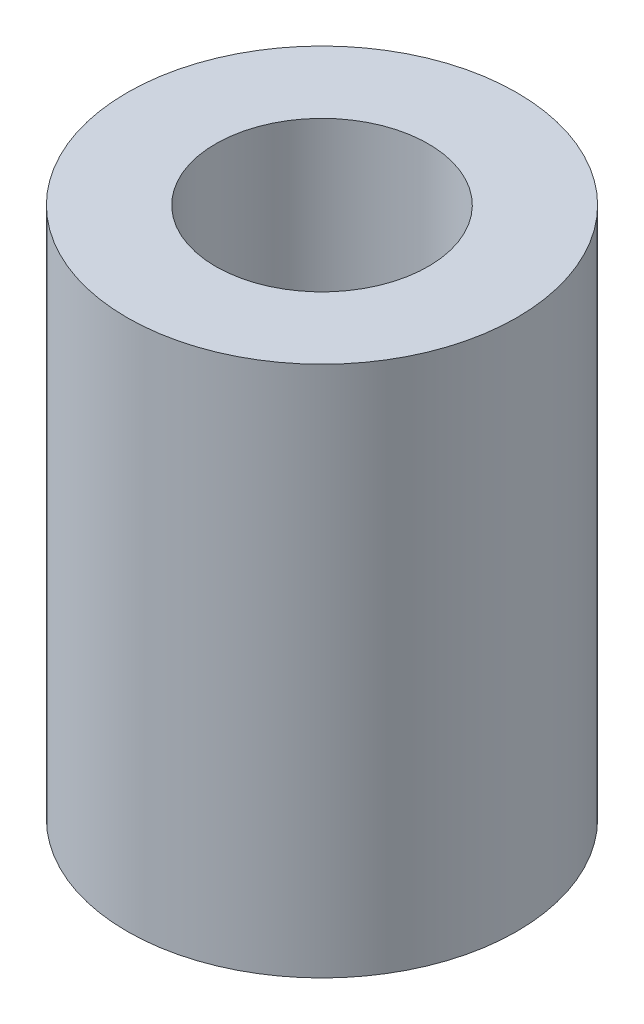
ISO-10303-21;
HEADER;
FILE_DESCRIPTION(('STEP AP214'),'2;1');
FILE_NAME('part.step','',(''),(''),'','','');
FILE_SCHEMA(('AUTOMOTIVE_DESIGN { 1 0 10303 214 1 1 1 1 }'));
ENDSEC;
DATA;
#1=APPLICATION_CONTEXT('core data for automotive mechanical design processes');
#2=APPLICATION_PROTOCOL_DEFINITION('international standard','automotive_design',2000,#1);
#3=PRODUCT_CONTEXT('',#1,'mechanical');
#4=PRODUCT('Part','Part','',(#3));
#5=PRODUCT_RELATED_PRODUCT_CATEGORY('part','',(#4));
#6=PRODUCT_DEFINITION_FORMATION('','',#4);
#7=PRODUCT_DEFINITION_CONTEXT('part definition',#1,'design');
#8=PRODUCT_DEFINITION('design','',#6,#7);
#9=PRODUCT_DEFINITION_SHAPE('','',#8);
#10=(LENGTH_UNIT() NAMED_UNIT(*) SI_UNIT(.MILLI.,.METRE.));
#11=(NAMED_UNIT(*) PLANE_ANGLE_UNIT() SI_UNIT($,.RADIAN.));
#12=(NAMED_UNIT(*) SI_UNIT($,.STERADIAN.) SOLID_ANGLE_UNIT());
#13=UNCERTAINTY_MEASURE_WITH_UNIT(LENGTH_MEASURE(1.E-05),#10,'distance_accuracy_value','');
#14=(GEOMETRIC_REPRESENTATION_CONTEXT(3) GLOBAL_UNCERTAINTY_ASSIGNED_CONTEXT((#13)) GLOBAL_UNIT_ASSIGNED_CONTEXT((#10,
#11,#12)) REPRESENTATION_CONTEXT('',''));
#15=CARTESIAN_POINT('',(0.,0.,0.));
#16=DIRECTION('',(0.,0.,1.));
#17=DIRECTION('',(1.,0.,0.));
#18=AXIS2_PLACEMENT_3D('',#15,#16,#17);
#19=CARTESIAN_POINT('',(0.,30.,0.));
#20=DIRECTION('',(0.,1.,0.));
#21=DIRECTION('',(0.,0.,1.));
#22=AXIS2_PLACEMENT_3D('',#19,#20,#21);
#23=PLANE('',#22);
#24=CARTESIAN_POINT('',(0.,30.,0.));
#25=DIRECTION('',(0.,1.,0.));
#26=DIRECTION('',(0.,0.,1.));
#27=AXIS2_PLACEMENT_3D('',#24,#25,#26);
#28=CIRCLE('',#27,11.);
#29=CARTESIAN_POINT('',(0.,30.,11.));
#30=VERTEX_POINT('',#29);
#31=EDGE_CURVE('E10',#30,#30,#28,.T.);
#32=ORIENTED_EDGE('',*,*,#31,.T.);
#33=EDGE_LOOP('',(#32));
#34=FACE_BOUND('',#33,.T.);
#35=CARTESIAN_POINT('',(0.,30.,0.));
#36=DIRECTION('',(0.,1.,0.));
#37=DIRECTION('',(0.,0.,1.));
#38=AXIS2_PLACEMENT_3D('',#35,#36,#37);
#39=CIRCLE('',#38,6.);
#40=CARTESIAN_POINT('',(0.,30.,6.));
#41=VERTEX_POINT('',#40);
#42=EDGE_CURVE('E50',#41,#41,#39,.T.);
#43=ORIENTED_EDGE('',*,*,#42,.F.);
#44=EDGE_LOOP('',(#43));
#45=FACE_BOUND('',#44,.T.);
#46=ADVANCED_FACE('F37',(#34,#45),#23,.T.);
#47=CARTESIAN_POINT('',(0.,0.,0.));
#48=DIRECTION('',(0.,1.,0.));
#49=DIRECTION('',(0.,0.,1.));
#50=AXIS2_PLACEMENT_3D('',#47,#48,#49);
#51=PLANE('',#50);
#52=CARTESIAN_POINT('',(0.,0.,0.));
#53=DIRECTION('',(0.,1.,0.));
#54=DIRECTION('',(0.,0.,1.));
#55=AXIS2_PLACEMENT_3D('',#52,#53,#54);
#56=CIRCLE('',#55,11.);
#57=CARTESIAN_POINT('',(0.,0.,11.));
#58=VERTEX_POINT('',#57);
#59=EDGE_CURVE('E41',#58,#58,#56,.T.);
#60=ORIENTED_EDGE('',*,*,#59,.F.);
#61=EDGE_LOOP('',(#60));
#62=FACE_BOUND('',#61,.T.);
#63=CARTESIAN_POINT('',(0.,0.,0.));
#64=DIRECTION('',(0.,1.,0.));
#65=DIRECTION('',(0.,0.,1.));
#66=AXIS2_PLACEMENT_3D('',#63,#64,#65);
#67=CIRCLE('',#66,6.);
#68=CARTESIAN_POINT('',(0.,0.,6.));
#69=VERTEX_POINT('',#68);
#70=EDGE_CURVE('E52',#69,#69,#67,.T.);
#71=ORIENTED_EDGE('',*,*,#70,.T.);
#72=EDGE_LOOP('',(#71));
#73=FACE_BOUND('',#72,.T.);
#74=ADVANCED_FACE('F64',(#62,#73),#51,.F.);
#75=CARTESIAN_POINT('',(0.,30.,0.));
#76=DIRECTION('',(0.,-1.,0.));
#77=DIRECTION('',(0.,0.,-1.));
#78=AXIS2_PLACEMENT_3D('',#75,#76,#77);
#79=CYLINDRICAL_SURFACE('',#78,11.);
#80=ORIENTED_EDGE('',*,*,#31,.F.);
#81=EDGE_LOOP('',(#80));
#82=FACE_BOUND('',#81,.T.);
#83=ORIENTED_EDGE('',*,*,#59,.T.);
#84=EDGE_LOOP('',(#83));
#85=FACE_BOUND('',#84,.T.);
#86=ADVANCED_FACE('F39',(#82,#85),#79,.T.);
#87=CARTESIAN_POINT('',(0.,30.,0.));
#88=DIRECTION('',(0.,-1.,0.));
#89=DIRECTION('',(0.,0.,-1.));
#90=AXIS2_PLACEMENT_3D('',#87,#88,#89);
#91=CYLINDRICAL_SURFACE('',#90,6.);
#92=ORIENTED_EDGE('',*,*,#42,.T.);
#93=EDGE_LOOP('',(#92));
#94=FACE_BOUND('',#93,.T.);
#95=ORIENTED_EDGE('',*,*,#70,.F.);
#96=EDGE_LOOP('',(#95));
#97=FACE_BOUND('',#96,.T.);
#98=ADVANCED_FACE('F60',(#94,#97),#91,.F.);
#99=CLOSED_SHELL('',(#46,#74,#86,#98));
#100=MANIFOLD_SOLID_BREP('B2',#99);
#101=ADVANCED_BREP_SHAPE_REPRESENTATION('',(#18,#100),#14);
#102=SHAPE_DEFINITION_REPRESENTATION(#9,#101);
ENDSEC;
END-ISO-10303-21;
